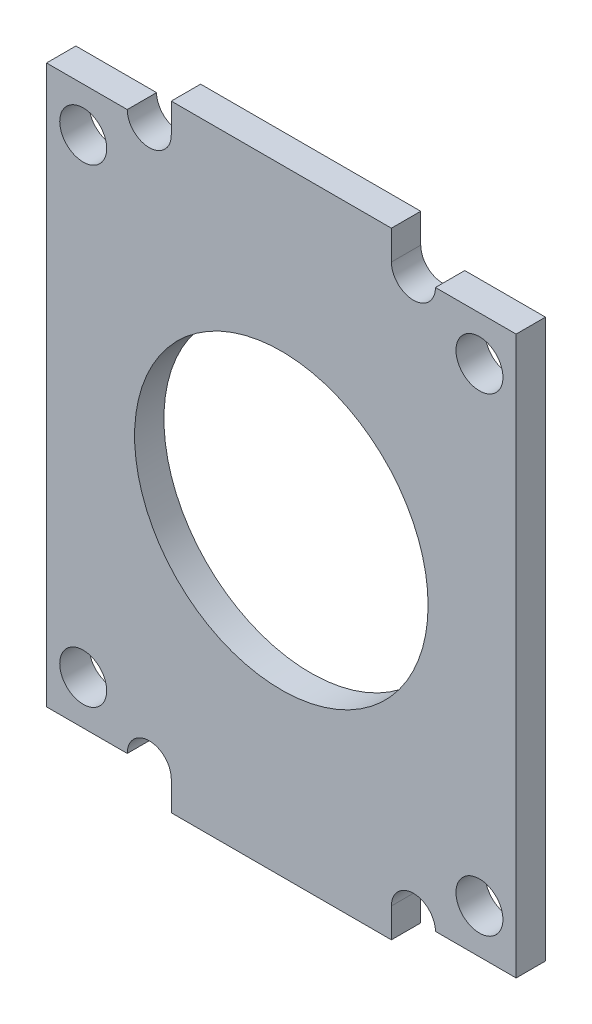
ISO-10303-21;
HEADER;
FILE_DESCRIPTION(('STEP AP214'),'2;1');
FILE_NAME('part.step','',(''),(''),'','','');
FILE_SCHEMA(('AUTOMOTIVE_DESIGN { 1 0 10303 214 1 1 1 1 }'));
ENDSEC;
DATA;
#1=APPLICATION_CONTEXT('core data for automotive mechanical design processes');
#2=APPLICATION_PROTOCOL_DEFINITION('international standard','automotive_design',2000,#1);
#3=PRODUCT_CONTEXT('',#1,'mechanical');
#4=PRODUCT('Part','Part','',(#3));
#5=PRODUCT_RELATED_PRODUCT_CATEGORY('part','',(#4));
#6=PRODUCT_DEFINITION_FORMATION('','',#4);
#7=PRODUCT_DEFINITION_CONTEXT('part definition',#1,'design');
#8=PRODUCT_DEFINITION('design','',#6,#7);
#9=PRODUCT_DEFINITION_SHAPE('','',#8);
#10=(LENGTH_UNIT() NAMED_UNIT(*) SI_UNIT(.MILLI.,.METRE.));
#11=(NAMED_UNIT(*) PLANE_ANGLE_UNIT() SI_UNIT($,.RADIAN.));
#12=(NAMED_UNIT(*) SI_UNIT($,.STERADIAN.) SOLID_ANGLE_UNIT());
#13=UNCERTAINTY_MEASURE_WITH_UNIT(LENGTH_MEASURE(1.E-05),#10,'distance_accuracy_value','');
#14=(GEOMETRIC_REPRESENTATION_CONTEXT(3) GLOBAL_UNCERTAINTY_ASSIGNED_CONTEXT((#13)) GLOBAL_UNIT_ASSIGNED_CONTEXT((#10,
#11,#12)) REPRESENTATION_CONTEXT('',''));
#15=CARTESIAN_POINT('',(0.,0.,0.));
#16=DIRECTION('',(0.,0.,1.));
#17=DIRECTION('',(1.,0.,0.));
#18=AXIS2_PLACEMENT_3D('',#15,#16,#17);
#19=CARTESIAN_POINT('',(-16.,-19.,2.));
#20=DIRECTION('',(0.,1.,0.));
#21=DIRECTION('',(0.,0.,1.));
#22=AXIS2_PLACEMENT_3D('',#19,#20,#21);
#23=PLANE('',#22);
#24=DIRECTION('',(1.,0.,0.));
#25=VECTOR('',#24,1.);
#26=CARTESIAN_POINT('',(-16.,-19.,2.));
#27=LINE('',#26,#25);
#28=CARTESIAN_POINT('',(10.5,-19.,2.));
#29=VERTEX_POINT('',#28);
#30=CARTESIAN_POINT('',(16.,-19.,2.));
#31=VERTEX_POINT('',#30);
#32=EDGE_CURVE('E52',#29,#31,#27,.T.);
#33=ORIENTED_EDGE('',*,*,#32,.F.);
#34=DIRECTION('',(0.,0.,1.));
#35=VECTOR('',#34,1.);
#36=CARTESIAN_POINT('',(10.5,-19.,-1.));
#37=LINE('',#36,#35);
#38=CARTESIAN_POINT('',(10.5,-19.,0.));
#39=VERTEX_POINT('',#38);
#40=EDGE_CURVE('E159',#29,#39,#37,.F.);
#41=ORIENTED_EDGE('',*,*,#40,.T.);
#42=DIRECTION('',(1.,0.,0.));
#43=VECTOR('',#42,1.);
#44=CARTESIAN_POINT('',(-16.,-19.,0.));
#45=LINE('',#44,#43);
#46=CARTESIAN_POINT('',(16.,-19.,0.));
#47=VERTEX_POINT('',#46);
#48=EDGE_CURVE('E78',#39,#47,#45,.T.);
#49=ORIENTED_EDGE('',*,*,#48,.T.);
#50=DIRECTION('',(0.,0.,-1.));
#51=VECTOR('',#50,1.);
#52=CARTESIAN_POINT('',(16.,-19.,2.));
#53=LINE('',#52,#51);
#54=EDGE_CURVE('E177',#31,#47,#53,.T.);
#55=ORIENTED_EDGE('',*,*,#54,.F.);
#56=EDGE_LOOP('',(#33,#41,#49,#55));
#57=FACE_BOUND('',#56,.T.);
#58=ADVANCED_FACE('F34',(#57),#23,.F.);
#59=CARTESIAN_POINT('',(-16.,19.,2.));
#60=DIRECTION('',(0.,-1.,0.));
#61=DIRECTION('',(0.,0.,-1.));
#62=AXIS2_PLACEMENT_3D('',#59,#60,#61);
#63=PLANE('',#62);
#64=DIRECTION('',(-1.,0.,0.));
#65=VECTOR('',#64,1.);
#66=CARTESIAN_POINT('',(-16.,19.,2.));
#67=LINE('',#66,#65);
#68=CARTESIAN_POINT('',(-10.5,19.,2.));
#69=VERTEX_POINT('',#68);
#70=CARTESIAN_POINT('',(-16.,19.,2.));
#71=VERTEX_POINT('',#70);
#72=EDGE_CURVE('E222',#69,#71,#67,.T.);
#73=ORIENTED_EDGE('',*,*,#72,.F.);
#74=DIRECTION('',(0.,0.,1.));
#75=VECTOR('',#74,1.);
#76=CARTESIAN_POINT('',(-10.5,19.,-1.));
#77=LINE('',#76,#75);
#78=CARTESIAN_POINT('',(-10.5,19.,0.));
#79=VERTEX_POINT('',#78);
#80=EDGE_CURVE('E272',#69,#79,#77,.F.);
#81=ORIENTED_EDGE('',*,*,#80,.T.);
#82=DIRECTION('',(-1.,0.,0.));
#83=VECTOR('',#82,1.);
#84=CARTESIAN_POINT('',(-16.,19.,0.));
#85=LINE('',#84,#83);
#86=CARTESIAN_POINT('',(-16.,19.,0.));
#87=VERTEX_POINT('',#86);
#88=EDGE_CURVE('E189',#79,#87,#85,.T.);
#89=ORIENTED_EDGE('',*,*,#88,.T.);
#90=DIRECTION('',(0.,0.,-1.));
#91=VECTOR('',#90,1.);
#92=CARTESIAN_POINT('',(-16.,19.,2.));
#93=LINE('',#92,#91);
#94=EDGE_CURVE('E44',#71,#87,#93,.T.);
#95=ORIENTED_EDGE('',*,*,#94,.F.);
#96=EDGE_LOOP('',(#73,#81,#89,#95));
#97=FACE_BOUND('',#96,.T.);
#98=ADVANCED_FACE('F354',(#97),#63,.F.);
#99=CARTESIAN_POINT('',(16.,19.,2.));
#100=DIRECTION('',(-1.,0.,0.));
#101=DIRECTION('',(0.,0.,1.));
#102=AXIS2_PLACEMENT_3D('',#99,#100,#101);
#103=PLANE('',#102);
#104=DIRECTION('',(0.,1.,0.));
#105=VECTOR('',#104,1.);
#106=CARTESIAN_POINT('',(16.,19.,0.));
#107=LINE('',#106,#105);
#108=CARTESIAN_POINT('',(16.,19.,0.));
#109=VERTEX_POINT('',#108);
#110=EDGE_CURVE('E186',#47,#109,#107,.T.);
#111=ORIENTED_EDGE('',*,*,#110,.T.);
#112=DIRECTION('',(0.,0.,-1.));
#113=VECTOR('',#112,1.);
#114=CARTESIAN_POINT('',(16.,19.,2.));
#115=LINE('',#114,#113);
#116=CARTESIAN_POINT('',(16.,19.,2.));
#117=VERTEX_POINT('',#116);
#118=EDGE_CURVE('E11',#117,#109,#115,.T.);
#119=ORIENTED_EDGE('',*,*,#118,.F.);
#120=DIRECTION('',(0.,1.,0.));
#121=VECTOR('',#120,1.);
#122=CARTESIAN_POINT('',(16.,19.,2.));
#123=LINE('',#122,#121);
#124=EDGE_CURVE('E197',#31,#117,#123,.T.);
#125=ORIENTED_EDGE('',*,*,#124,.F.);
#126=ORIENTED_EDGE('',*,*,#54,.T.);
#127=EDGE_LOOP('',(#111,#119,#125,#126));
#128=FACE_BOUND('',#127,.T.);
#129=ADVANCED_FACE('F36',(#128),#103,.F.);
#130=CARTESIAN_POINT('',(10.5,19.,0.));
#131=VERTEX_POINT('',#130);
#132=EDGE_CURVE('E190',#109,#131,#85,.T.);
#133=ORIENTED_EDGE('',*,*,#132,.T.);
#134=DIRECTION('',(0.,0.,1.));
#135=VECTOR('',#134,1.);
#136=CARTESIAN_POINT('',(10.5,19.,-1.));
#137=LINE('',#136,#135);
#138=CARTESIAN_POINT('',(10.5,19.,2.));
#139=VERTEX_POINT('',#138);
#140=EDGE_CURVE('E284',#131,#139,#137,.T.);
#141=ORIENTED_EDGE('',*,*,#140,.T.);
#142=EDGE_CURVE('E85',#117,#139,#67,.T.);
#143=ORIENTED_EDGE('',*,*,#142,.F.);
#144=ORIENTED_EDGE('',*,*,#118,.T.);
#145=EDGE_LOOP('',(#133,#141,#143,#144));
#146=FACE_BOUND('',#145,.T.);
#147=ADVANCED_FACE('F359',(#146),#63,.F.);
#148=CARTESIAN_POINT('',(-16.,19.,2.));
#149=DIRECTION('',(1.,0.,0.));
#150=DIRECTION('',(0.,0.,-1.));
#151=AXIS2_PLACEMENT_3D('',#148,#149,#150);
#152=PLANE('',#151);
#153=DIRECTION('',(0.,-1.,0.));
#154=VECTOR('',#153,1.);
#155=CARTESIAN_POINT('',(-16.,19.,0.));
#156=LINE('',#155,#154);
#157=CARTESIAN_POINT('',(-16.,-19.,0.));
#158=VERTEX_POINT('',#157);
#159=EDGE_CURVE('E71',#87,#158,#156,.T.);
#160=ORIENTED_EDGE('',*,*,#159,.T.);
#161=DIRECTION('',(0.,0.,-1.));
#162=VECTOR('',#161,1.);
#163=CARTESIAN_POINT('',(-16.,-19.,2.));
#164=LINE('',#163,#162);
#165=CARTESIAN_POINT('',(-16.,-19.,2.));
#166=VERTEX_POINT('',#165);
#167=EDGE_CURVE('E199',#166,#158,#164,.T.);
#168=ORIENTED_EDGE('',*,*,#167,.F.);
#169=DIRECTION('',(0.,-1.,0.));
#170=VECTOR('',#169,1.);
#171=CARTESIAN_POINT('',(-16.,19.,2.));
#172=LINE('',#171,#170);
#173=EDGE_CURVE('E180',#71,#166,#172,.T.);
#174=ORIENTED_EDGE('',*,*,#173,.F.);
#175=ORIENTED_EDGE('',*,*,#94,.T.);
#176=EDGE_LOOP('',(#160,#168,#174,#175));
#177=FACE_BOUND('',#176,.T.);
#178=ADVANCED_FACE('F203',(#177),#152,.F.);
#179=CARTESIAN_POINT('',(-10.5,-19.,0.));
#180=VERTEX_POINT('',#179);
#181=EDGE_CURVE('E194',#158,#180,#45,.T.);
#182=ORIENTED_EDGE('',*,*,#181,.T.);
#183=DIRECTION('',(0.,0.,1.));
#184=VECTOR('',#183,1.);
#185=CARTESIAN_POINT('',(-10.5,-19.,-1.));
#186=LINE('',#185,#184);
#187=CARTESIAN_POINT('',(-10.5,-19.,2.));
#188=VERTEX_POINT('',#187);
#189=EDGE_CURVE('E217',#180,#188,#186,.T.);
#190=ORIENTED_EDGE('',*,*,#189,.T.);
#191=EDGE_CURVE('E179',#166,#188,#27,.T.);
#192=ORIENTED_EDGE('',*,*,#191,.F.);
#193=ORIENTED_EDGE('',*,*,#167,.T.);
#194=EDGE_LOOP('',(#182,#190,#192,#193));
#195=FACE_BOUND('',#194,.T.);
#196=ADVANCED_FACE('F215',(#195),#23,.F.);
#197=CARTESIAN_POINT('',(0.,0.,2.));
#198=DIRECTION('',(0.,0.,1.));
#199=DIRECTION('',(1.,0.,0.));
#200=AXIS2_PLACEMENT_3D('',#197,#198,#199);
#201=PLANE('',#200);
#202=CARTESIAN_POINT('',(13.5,-16.,2.));
#203=DIRECTION('',(0.,0.,1.));
#204=DIRECTION('',(1.,0.,0.));
#205=AXIS2_PLACEMENT_3D('',#202,#203,#204);
#206=CIRCLE('',#205,1.6);
#207=CARTESIAN_POINT('',(15.1,-16.,2.));
#208=VERTEX_POINT('',#207);
#209=EDGE_CURVE('E312',#208,#208,#206,.T.);
#210=ORIENTED_EDGE('',*,*,#209,.F.);
#211=EDGE_LOOP('',(#210));
#212=FACE_BOUND('',#211,.T.);
#213=CARTESIAN_POINT('',(-13.5,-16.,2.));
#214=DIRECTION('',(0.,0.,1.));
#215=DIRECTION('',(-1.,0.,0.));
#216=AXIS2_PLACEMENT_3D('',#213,#214,#215);
#217=CIRCLE('',#216,1.6);
#218=CARTESIAN_POINT('',(-15.1,-16.,2.));
#219=VERTEX_POINT('',#218);
#220=EDGE_CURVE('E306',#219,#219,#217,.T.);
#221=ORIENTED_EDGE('',*,*,#220,.F.);
#222=EDGE_LOOP('',(#221));
#223=FACE_BOUND('',#222,.T.);
#224=CARTESIAN_POINT('',(-13.5,16.,2.));
#225=DIRECTION('',(0.,0.,1.));
#226=DIRECTION('',(-1.,0.,0.));
#227=AXIS2_PLACEMENT_3D('',#224,#225,#226);
#228=CIRCLE('',#227,1.6);
#229=CARTESIAN_POINT('',(-15.1,16.,2.));
#230=VERTEX_POINT('',#229);
#231=EDGE_CURVE('E300',#230,#230,#228,.T.);
#232=ORIENTED_EDGE('',*,*,#231,.F.);
#233=EDGE_LOOP('',(#232));
#234=FACE_BOUND('',#233,.T.);
#235=CARTESIAN_POINT('',(13.5,16.,2.));
#236=DIRECTION('',(0.,0.,1.));
#237=DIRECTION('',(1.,0.,0.));
#238=AXIS2_PLACEMENT_3D('',#235,#236,#237);
#239=CIRCLE('',#238,1.6);
#240=CARTESIAN_POINT('',(15.1,16.,2.));
#241=VERTEX_POINT('',#240);
#242=EDGE_CURVE('E294',#241,#241,#239,.T.);
#243=ORIENTED_EDGE('',*,*,#242,.F.);
#244=EDGE_LOOP('',(#243));
#245=FACE_BOUND('',#244,.T.);
#246=CARTESIAN_POINT('',(-9.,-19.,2.));
#247=DIRECTION('',(0.,0.,1.));
#248=DIRECTION('',(1.,0.,0.));
#249=AXIS2_PLACEMENT_3D('',#246,#247,#248);
#250=CIRCLE('',#249,1.5);
#251=CARTESIAN_POINT('',(-7.5,-19.,2.));
#252=VERTEX_POINT('',#251);
#253=EDGE_CURVE('E219',#252,#188,#250,.T.);
#254=ORIENTED_EDGE('',*,*,#253,.F.);
#255=DIRECTION('',(0.,-1.,0.));
#256=VECTOR('',#255,1.);
#257=CARTESIAN_POINT('',(-7.5,-19.,2.));
#258=LINE('',#257,#256);
#259=CARTESIAN_POINT('',(-7.5,-21.,2.));
#260=VERTEX_POINT('',#259);
#261=EDGE_CURVE('E270',#252,#260,#258,.T.);
#262=ORIENTED_EDGE('',*,*,#261,.T.);
#263=DIRECTION('',(1.,0.,0.));
#264=VECTOR('',#263,1.);
#265=CARTESIAN_POINT('',(-7.5,-21.,2.));
#266=LINE('',#265,#264);
#267=CARTESIAN_POINT('',(7.5,-21.,2.));
#268=VERTEX_POINT('',#267);
#269=EDGE_CURVE('E268',#260,#268,#266,.T.);
#270=ORIENTED_EDGE('',*,*,#269,.T.);
#271=DIRECTION('',(0.,1.,0.));
#272=VECTOR('',#271,1.);
#273=CARTESIAN_POINT('',(7.5,-19.,2.));
#274=LINE('',#273,#272);
#275=CARTESIAN_POINT('',(7.5,-19.,2.));
#276=VERTEX_POINT('',#275);
#277=EDGE_CURVE('E173',#268,#276,#274,.T.);
#278=ORIENTED_EDGE('',*,*,#277,.T.);
#279=CARTESIAN_POINT('',(9.,-19.,2.));
#280=DIRECTION('',(0.,0.,1.));
#281=DIRECTION('',(1.,0.,0.));
#282=AXIS2_PLACEMENT_3D('',#279,#280,#281);
#283=CIRCLE('',#282,1.5);
#284=EDGE_CURVE('E161',#29,#276,#283,.T.);
#285=ORIENTED_EDGE('',*,*,#284,.F.);
#286=ORIENTED_EDGE('',*,*,#32,.T.);
#287=ORIENTED_EDGE('',*,*,#124,.T.);
#288=ORIENTED_EDGE('',*,*,#142,.T.);
#289=CARTESIAN_POINT('',(9.,19.,2.));
#290=DIRECTION('',(0.,0.,1.));
#291=DIRECTION('',(1.,0.,0.));
#292=AXIS2_PLACEMENT_3D('',#289,#290,#291);
#293=CIRCLE('',#292,1.5);
#294=CARTESIAN_POINT('',(7.49999999999999,19.,2.));
#295=VERTEX_POINT('',#294);
#296=EDGE_CURVE('E174',#295,#139,#293,.T.);
#297=ORIENTED_EDGE('',*,*,#296,.F.);
#298=DIRECTION('',(0.,1.,0.));
#299=VECTOR('',#298,1.);
#300=CARTESIAN_POINT('',(7.49999999999999,19.,2.));
#301=LINE('',#300,#299);
#302=CARTESIAN_POINT('',(7.49999999999999,21.,2.));
#303=VERTEX_POINT('',#302);
#304=EDGE_CURVE('E245',#295,#303,#301,.T.);
#305=ORIENTED_EDGE('',*,*,#304,.T.);
#306=DIRECTION('',(-1.,0.,0.));
#307=VECTOR('',#306,1.);
#308=CARTESIAN_POINT('',(-7.5,21.,2.));
#309=LINE('',#308,#307);
#310=CARTESIAN_POINT('',(-7.5,21.,2.));
#311=VERTEX_POINT('',#310);
#312=EDGE_CURVE('E241',#303,#311,#309,.T.);
#313=ORIENTED_EDGE('',*,*,#312,.T.);
#314=DIRECTION('',(0.,-1.,0.));
#315=VECTOR('',#314,1.);
#316=CARTESIAN_POINT('',(-7.5,19.,2.));
#317=LINE('',#316,#315);
#318=CARTESIAN_POINT('',(-7.5,19.,2.));
#319=VERTEX_POINT('',#318);
#320=EDGE_CURVE('E248',#311,#319,#317,.T.);
#321=ORIENTED_EDGE('',*,*,#320,.T.);
#322=CARTESIAN_POINT('',(-9.,19.,2.));
#323=DIRECTION('',(0.,0.,1.));
#324=DIRECTION('',(1.,0.,0.));
#325=AXIS2_PLACEMENT_3D('',#322,#323,#324);
#326=CIRCLE('',#325,1.5);
#327=EDGE_CURVE('E224',#69,#319,#326,.T.);
#328=ORIENTED_EDGE('',*,*,#327,.F.);
#329=ORIENTED_EDGE('',*,*,#72,.T.);
#330=ORIENTED_EDGE('',*,*,#173,.T.);
#331=ORIENTED_EDGE('',*,*,#191,.T.);
#332=EDGE_LOOP('',(#254,#262,#270,#278,#285,#286,#287,#288,#297,#305,#313,#321,#328,#329,#330,#331));
#333=FACE_BOUND('',#332,.T.);
#334=CARTESIAN_POINT('',(0.,0.,2.));
#335=DIRECTION('',(0.,0.,1.));
#336=DIRECTION('',(1.,0.,0.));
#337=AXIS2_PLACEMENT_3D('',#334,#335,#336);
#338=CIRCLE('',#337,10.);
#339=CARTESIAN_POINT('',(10.,0.,2.));
#340=VERTEX_POINT('',#339);
#341=EDGE_CURVE('E228',#340,#340,#338,.T.);
#342=ORIENTED_EDGE('',*,*,#341,.F.);
#343=EDGE_LOOP('',(#342));
#344=FACE_BOUND('',#343,.T.);
#345=ADVANCED_FACE('F169',(#212,#223,#234,#245,#333,#344),#201,.T.);
#346=CARTESIAN_POINT('',(0.,0.,0.));
#347=DIRECTION('',(0.,0.,1.));
#348=DIRECTION('',(1.,0.,0.));
#349=AXIS2_PLACEMENT_3D('',#346,#347,#348);
#350=PLANE('',#349);
#351=CARTESIAN_POINT('',(13.5,-16.,0.));
#352=DIRECTION('',(0.,0.,1.));
#353=DIRECTION('',(1.,0.,0.));
#354=AXIS2_PLACEMENT_3D('',#351,#352,#353);
#355=CIRCLE('',#354,1.6);
#356=CARTESIAN_POINT('',(15.1,-16.,0.));
#357=VERTEX_POINT('',#356);
#358=EDGE_CURVE('E297',#357,#357,#355,.T.);
#359=ORIENTED_EDGE('',*,*,#358,.T.);
#360=EDGE_LOOP('',(#359));
#361=FACE_BOUND('',#360,.T.);
#362=CARTESIAN_POINT('',(-13.5,-16.,0.));
#363=DIRECTION('',(0.,0.,1.));
#364=DIRECTION('',(-1.,0.,0.));
#365=AXIS2_PLACEMENT_3D('',#362,#363,#364);
#366=CIRCLE('',#365,1.6);
#367=CARTESIAN_POINT('',(-15.1,-16.,0.));
#368=VERTEX_POINT('',#367);
#369=EDGE_CURVE('E309',#368,#368,#366,.T.);
#370=ORIENTED_EDGE('',*,*,#369,.T.);
#371=EDGE_LOOP('',(#370));
#372=FACE_BOUND('',#371,.T.);
#373=CARTESIAN_POINT('',(-13.5,16.,0.));
#374=DIRECTION('',(0.,0.,1.));
#375=DIRECTION('',(-1.,0.,0.));
#376=AXIS2_PLACEMENT_3D('',#373,#374,#375);
#377=CIRCLE('',#376,1.6);
#378=CARTESIAN_POINT('',(-15.1,16.,0.));
#379=VERTEX_POINT('',#378);
#380=EDGE_CURVE('E303',#379,#379,#377,.T.);
#381=ORIENTED_EDGE('',*,*,#380,.T.);
#382=EDGE_LOOP('',(#381));
#383=FACE_BOUND('',#382,.T.);
#384=CARTESIAN_POINT('',(13.5,16.,0.));
#385=DIRECTION('',(0.,0.,1.));
#386=DIRECTION('',(1.,0.,0.));
#387=AXIS2_PLACEMENT_3D('',#384,#385,#386);
#388=CIRCLE('',#387,1.6);
#389=CARTESIAN_POINT('',(15.1,16.,0.));
#390=VERTEX_POINT('',#389);
#391=EDGE_CURVE('E175',#390,#390,#388,.T.);
#392=ORIENTED_EDGE('',*,*,#391,.T.);
#393=EDGE_LOOP('',(#392));
#394=FACE_BOUND('',#393,.T.);
#395=CARTESIAN_POINT('',(0.,0.,0.));
#396=DIRECTION('',(0.,0.,1.));
#397=DIRECTION('',(1.,0.,0.));
#398=AXIS2_PLACEMENT_3D('',#395,#396,#397);
#399=CIRCLE('',#398,10.);
#400=CARTESIAN_POINT('',(10.,0.,0.));
#401=VERTEX_POINT('',#400);
#402=EDGE_CURVE('E38',#401,#401,#399,.T.);
#403=ORIENTED_EDGE('',*,*,#402,.T.);
#404=EDGE_LOOP('',(#403));
#405=FACE_BOUND('',#404,.T.);
#406=DIRECTION('',(0.,-1.,0.));
#407=VECTOR('',#406,1.);
#408=CARTESIAN_POINT('',(-7.5,-19.,0.));
#409=LINE('',#408,#407);
#410=CARTESIAN_POINT('',(-7.5,-19.,0.));
#411=VERTEX_POINT('',#410);
#412=CARTESIAN_POINT('',(-7.5,-21.,0.));
#413=VERTEX_POINT('',#412);
#414=EDGE_CURVE('E267',#411,#413,#409,.T.);
#415=ORIENTED_EDGE('',*,*,#414,.F.);
#416=CARTESIAN_POINT('',(-9.,-19.,0.));
#417=DIRECTION('',(0.,0.,1.));
#418=DIRECTION('',(1.,0.,0.));
#419=AXIS2_PLACEMENT_3D('',#416,#417,#418);
#420=CIRCLE('',#419,1.5);
#421=EDGE_CURVE('E165',#411,#180,#420,.T.);
#422=ORIENTED_EDGE('',*,*,#421,.T.);
#423=ORIENTED_EDGE('',*,*,#181,.F.);
#424=ORIENTED_EDGE('',*,*,#159,.F.);
#425=ORIENTED_EDGE('',*,*,#88,.F.);
#426=CARTESIAN_POINT('',(-9.,19.,0.));
#427=DIRECTION('',(0.,0.,1.));
#428=DIRECTION('',(1.,0.,0.));
#429=AXIS2_PLACEMENT_3D('',#426,#427,#428);
#430=CIRCLE('',#429,1.5);
#431=CARTESIAN_POINT('',(-7.5,19.,0.));
#432=VERTEX_POINT('',#431);
#433=EDGE_CURVE('E281',#79,#432,#430,.T.);
#434=ORIENTED_EDGE('',*,*,#433,.T.);
#435=DIRECTION('',(0.,-1.,0.));
#436=VECTOR('',#435,1.);
#437=CARTESIAN_POINT('',(-7.5,19.,0.));
#438=LINE('',#437,#436);
#439=CARTESIAN_POINT('',(-7.5,21.,0.));
#440=VERTEX_POINT('',#439);
#441=EDGE_CURVE('E244',#440,#432,#438,.T.);
#442=ORIENTED_EDGE('',*,*,#441,.F.);
#443=DIRECTION('',(-1.,0.,0.));
#444=VECTOR('',#443,1.);
#445=CARTESIAN_POINT('',(-7.5,21.,0.));
#446=LINE('',#445,#444);
#447=CARTESIAN_POINT('',(7.49999999999999,21.,0.));
#448=VERTEX_POINT('',#447);
#449=EDGE_CURVE('E236',#448,#440,#446,.T.);
#450=ORIENTED_EDGE('',*,*,#449,.F.);
#451=DIRECTION('',(0.,1.,0.));
#452=VECTOR('',#451,1.);
#453=CARTESIAN_POINT('',(7.49999999999999,19.,0.));
#454=LINE('',#453,#452);
#455=CARTESIAN_POINT('',(7.49999999999999,19.,0.));
#456=VERTEX_POINT('',#455);
#457=EDGE_CURVE('E253',#456,#448,#454,.T.);
#458=ORIENTED_EDGE('',*,*,#457,.F.);
#459=CARTESIAN_POINT('',(9.,19.,0.));
#460=DIRECTION('',(0.,0.,1.));
#461=DIRECTION('',(1.,0.,0.));
#462=AXIS2_PLACEMENT_3D('',#459,#460,#461);
#463=CIRCLE('',#462,1.5);
#464=EDGE_CURVE('E286',#456,#131,#463,.T.);
#465=ORIENTED_EDGE('',*,*,#464,.T.);
#466=ORIENTED_EDGE('',*,*,#132,.F.);
#467=ORIENTED_EDGE('',*,*,#110,.F.);
#468=ORIENTED_EDGE('',*,*,#48,.F.);
#469=CARTESIAN_POINT('',(9.,-19.,0.));
#470=DIRECTION('',(0.,0.,1.));
#471=DIRECTION('',(1.,0.,0.));
#472=AXIS2_PLACEMENT_3D('',#469,#470,#471);
#473=CIRCLE('',#472,1.5);
#474=CARTESIAN_POINT('',(7.5,-19.,0.));
#475=VERTEX_POINT('',#474);
#476=EDGE_CURVE('E164',#39,#475,#473,.T.);
#477=ORIENTED_EDGE('',*,*,#476,.T.);
#478=DIRECTION('',(0.,1.,0.));
#479=VECTOR('',#478,1.);
#480=CARTESIAN_POINT('',(7.5,-19.,0.));
#481=LINE('',#480,#479);
#482=CARTESIAN_POINT('',(7.5,-21.,0.));
#483=VERTEX_POINT('',#482);
#484=EDGE_CURVE('E261',#483,#475,#481,.T.);
#485=ORIENTED_EDGE('',*,*,#484,.F.);
#486=DIRECTION('',(1.,0.,0.));
#487=VECTOR('',#486,1.);
#488=CARTESIAN_POINT('',(-7.5,-21.,0.));
#489=LINE('',#488,#487);
#490=EDGE_CURVE('E275',#413,#483,#489,.T.);
#491=ORIENTED_EDGE('',*,*,#490,.F.);
#492=EDGE_LOOP('',(#415,#422,#423,#424,#425,#434,#442,#450,#458,#465,#466,#467,#468,#477,#485,#491));
#493=FACE_BOUND('',#492,.T.);
#494=ADVANCED_FACE('F210',(#361,#372,#383,#394,#405,#493),#350,.F.);
#495=CARTESIAN_POINT('',(0.,0.,-1.));
#496=DIRECTION('',(0.,0.,1.));
#497=DIRECTION('',(1.,0.,0.));
#498=AXIS2_PLACEMENT_3D('',#495,#496,#497);
#499=CYLINDRICAL_SURFACE('',#498,10.);
#500=ORIENTED_EDGE('',*,*,#341,.T.);
#501=EDGE_LOOP('',(#500));
#502=FACE_BOUND('',#501,.T.);
#503=ORIENTED_EDGE('',*,*,#402,.F.);
#504=EDGE_LOOP('',(#503));
#505=FACE_BOUND('',#504,.T.);
#506=ADVANCED_FACE('F416',(#502,#505),#499,.F.);
#507=CARTESIAN_POINT('',(-7.5,19.,0.));
#508=DIRECTION('',(-1.,0.,0.));
#509=DIRECTION('',(0.,0.,1.));
#510=AXIS2_PLACEMENT_3D('',#507,#508,#509);
#511=PLANE('',#510);
#512=ORIENTED_EDGE('',*,*,#320,.F.);
#513=DIRECTION('',(0.,0.,1.));
#514=VECTOR('',#513,1.);
#515=CARTESIAN_POINT('',(-7.5,21.,0.));
#516=LINE('',#515,#514);
#517=EDGE_CURVE('E231',#440,#311,#516,.T.);
#518=ORIENTED_EDGE('',*,*,#517,.F.);
#519=ORIENTED_EDGE('',*,*,#441,.T.);
#520=DIRECTION('',(0.,0.,1.));
#521=VECTOR('',#520,1.);
#522=CARTESIAN_POINT('',(-7.5,19.,0.));
#523=LINE('',#522,#521);
#524=EDGE_CURVE('E232',#432,#319,#523,.T.);
#525=ORIENTED_EDGE('',*,*,#524,.T.);
#526=EDGE_LOOP('',(#512,#518,#519,#525));
#527=FACE_BOUND('',#526,.T.);
#528=ADVANCED_FACE('F388',(#527),#511,.T.);
#529=CARTESIAN_POINT('',(-7.5,21.,0.));
#530=DIRECTION('',(0.,1.,0.));
#531=DIRECTION('',(0.,0.,1.));
#532=AXIS2_PLACEMENT_3D('',#529,#530,#531);
#533=PLANE('',#532);
#534=ORIENTED_EDGE('',*,*,#312,.F.);
#535=DIRECTION('',(0.,0.,1.));
#536=VECTOR('',#535,1.);
#537=CARTESIAN_POINT('',(7.49999999999999,21.,0.));
#538=LINE('',#537,#536);
#539=EDGE_CURVE('E238',#448,#303,#538,.T.);
#540=ORIENTED_EDGE('',*,*,#539,.F.);
#541=ORIENTED_EDGE('',*,*,#449,.T.);
#542=ORIENTED_EDGE('',*,*,#517,.T.);
#543=EDGE_LOOP('',(#534,#540,#541,#542));
#544=FACE_BOUND('',#543,.T.);
#545=ADVANCED_FACE('F384',(#544),#533,.T.);
#546=CARTESIAN_POINT('',(7.49999999999999,19.,0.));
#547=DIRECTION('',(1.,0.,0.));
#548=DIRECTION('',(0.,0.,-1.));
#549=AXIS2_PLACEMENT_3D('',#546,#547,#548);
#550=PLANE('',#549);
#551=ORIENTED_EDGE('',*,*,#304,.F.);
#552=DIRECTION('',(0.,0.,1.));
#553=VECTOR('',#552,1.);
#554=CARTESIAN_POINT('',(7.49999999999999,19.,0.));
#555=LINE('',#554,#553);
#556=EDGE_CURVE('E235',#456,#295,#555,.T.);
#557=ORIENTED_EDGE('',*,*,#556,.F.);
#558=ORIENTED_EDGE('',*,*,#457,.T.);
#559=ORIENTED_EDGE('',*,*,#539,.T.);
#560=EDGE_LOOP('',(#551,#557,#558,#559));
#561=FACE_BOUND('',#560,.T.);
#562=ADVANCED_FACE('F381',(#561),#550,.T.);
#563=CARTESIAN_POINT('',(-7.5,-19.,0.));
#564=DIRECTION('',(-1.,0.,0.));
#565=DIRECTION('',(0.,0.,1.));
#566=AXIS2_PLACEMENT_3D('',#563,#564,#565);
#567=PLANE('',#566);
#568=ORIENTED_EDGE('',*,*,#261,.F.);
#569=DIRECTION('',(0.,0.,1.));
#570=VECTOR('',#569,1.);
#571=CARTESIAN_POINT('',(-7.5,-19.,0.));
#572=LINE('',#571,#570);
#573=EDGE_CURVE('E250',#411,#252,#572,.T.);
#574=ORIENTED_EDGE('',*,*,#573,.F.);
#575=ORIENTED_EDGE('',*,*,#414,.T.);
#576=DIRECTION('',(0.,0.,1.));
#577=VECTOR('',#576,1.);
#578=CARTESIAN_POINT('',(-7.5,-21.,0.));
#579=LINE('',#578,#577);
#580=EDGE_CURVE('E258',#413,#260,#579,.T.);
#581=ORIENTED_EDGE('',*,*,#580,.T.);
#582=EDGE_LOOP('',(#568,#574,#575,#581));
#583=FACE_BOUND('',#582,.T.);
#584=ADVANCED_FACE('F404',(#583),#567,.T.);
#585=CARTESIAN_POINT('',(7.5,-19.,0.));
#586=DIRECTION('',(1.,0.,0.));
#587=DIRECTION('',(0.,0.,-1.));
#588=AXIS2_PLACEMENT_3D('',#585,#586,#587);
#589=PLANE('',#588);
#590=ORIENTED_EDGE('',*,*,#277,.F.);
#591=DIRECTION('',(0.,0.,1.));
#592=VECTOR('',#591,1.);
#593=CARTESIAN_POINT('',(7.5,-21.,0.));
#594=LINE('',#593,#592);
#595=EDGE_CURVE('E260',#483,#268,#594,.T.);
#596=ORIENTED_EDGE('',*,*,#595,.F.);
#597=ORIENTED_EDGE('',*,*,#484,.T.);
#598=DIRECTION('',(0.,0.,1.));
#599=VECTOR('',#598,1.);
#600=CARTESIAN_POINT('',(7.5,-19.,0.));
#601=LINE('',#600,#599);
#602=EDGE_CURVE('E263',#475,#276,#601,.T.);
#603=ORIENTED_EDGE('',*,*,#602,.T.);
#604=EDGE_LOOP('',(#590,#596,#597,#603));
#605=FACE_BOUND('',#604,.T.);
#606=ADVANCED_FACE('F399',(#605),#589,.T.);
#607=CARTESIAN_POINT('',(-7.5,-21.,0.));
#608=DIRECTION('',(0.,-1.,0.));
#609=DIRECTION('',(0.,0.,-1.));
#610=AXIS2_PLACEMENT_3D('',#607,#608,#609);
#611=PLANE('',#610);
#612=ORIENTED_EDGE('',*,*,#269,.F.);
#613=ORIENTED_EDGE('',*,*,#580,.F.);
#614=ORIENTED_EDGE('',*,*,#490,.T.);
#615=ORIENTED_EDGE('',*,*,#595,.T.);
#616=EDGE_LOOP('',(#612,#613,#614,#615));
#617=FACE_BOUND('',#616,.T.);
#618=ADVANCED_FACE('F392',(#617),#611,.T.);
#619=CARTESIAN_POINT('',(-9.,19.,-1.));
#620=DIRECTION('',(0.,0.,1.));
#621=DIRECTION('',(1.,0.,0.));
#622=AXIS2_PLACEMENT_3D('',#619,#620,#621);
#623=CYLINDRICAL_SURFACE('',#622,1.5);
#624=ORIENTED_EDGE('',*,*,#327,.T.);
#625=ORIENTED_EDGE('',*,*,#524,.F.);
#626=ORIENTED_EDGE('',*,*,#433,.F.);
#627=ORIENTED_EDGE('',*,*,#80,.F.);
#628=EDGE_LOOP('',(#624,#625,#626,#627));
#629=FACE_BOUND('',#628,.T.);
#630=ADVANCED_FACE('F390',(#629),#623,.F.);
#631=CARTESIAN_POINT('',(9.,-19.,-1.));
#632=DIRECTION('',(0.,0.,1.));
#633=DIRECTION('',(1.,0.,0.));
#634=AXIS2_PLACEMENT_3D('',#631,#632,#633);
#635=CYLINDRICAL_SURFACE('',#634,1.5);
#636=ORIENTED_EDGE('',*,*,#284,.T.);
#637=ORIENTED_EDGE('',*,*,#602,.F.);
#638=ORIENTED_EDGE('',*,*,#476,.F.);
#639=ORIENTED_EDGE('',*,*,#40,.F.);
#640=EDGE_LOOP('',(#636,#637,#638,#639));
#641=FACE_BOUND('',#640,.T.);
#642=ADVANCED_FACE('F160',(#641),#635,.F.);
#643=CARTESIAN_POINT('',(-9.,-19.,-1.));
#644=DIRECTION('',(0.,0.,1.));
#645=DIRECTION('',(1.,0.,0.));
#646=AXIS2_PLACEMENT_3D('',#643,#644,#645);
#647=CYLINDRICAL_SURFACE('',#646,1.5);
#648=ORIENTED_EDGE('',*,*,#421,.F.);
#649=ORIENTED_EDGE('',*,*,#573,.T.);
#650=ORIENTED_EDGE('',*,*,#253,.T.);
#651=ORIENTED_EDGE('',*,*,#189,.F.);
#652=EDGE_LOOP('',(#648,#649,#650,#651));
#653=FACE_BOUND('',#652,.T.);
#654=ADVANCED_FACE('F348',(#653),#647,.F.);
#655=CARTESIAN_POINT('',(9.,19.,-1.));
#656=DIRECTION('',(0.,0.,1.));
#657=DIRECTION('',(1.,0.,0.));
#658=AXIS2_PLACEMENT_3D('',#655,#656,#657);
#659=CYLINDRICAL_SURFACE('',#658,1.5);
#660=ORIENTED_EDGE('',*,*,#464,.F.);
#661=ORIENTED_EDGE('',*,*,#556,.T.);
#662=ORIENTED_EDGE('',*,*,#296,.T.);
#663=ORIENTED_EDGE('',*,*,#140,.F.);
#664=EDGE_LOOP('',(#660,#661,#662,#663));
#665=FACE_BOUND('',#664,.T.);
#666=ADVANCED_FACE('F339',(#665),#659,.F.);
#667=CARTESIAN_POINT('',(13.5,16.,0.));
#668=DIRECTION('',(0.,0.,1.));
#669=DIRECTION('',(1.,0.,0.));
#670=AXIS2_PLACEMENT_3D('',#667,#668,#669);
#671=CYLINDRICAL_SURFACE('',#670,1.6);
#672=ORIENTED_EDGE('',*,*,#391,.F.);
#673=EDGE_LOOP('',(#672));
#674=FACE_BOUND('',#673,.T.);
#675=ORIENTED_EDGE('',*,*,#242,.T.);
#676=EDGE_LOOP('',(#675));
#677=FACE_BOUND('',#676,.T.);
#678=ADVANCED_FACE('F336',(#674,#677),#671,.F.);
#679=CARTESIAN_POINT('',(-13.5,16.,0.));
#680=DIRECTION('',(0.,0.,1.));
#681=DIRECTION('',(1.,0.,0.));
#682=AXIS2_PLACEMENT_3D('',#679,#680,#681);
#683=CYLINDRICAL_SURFACE('',#682,1.6);
#684=ORIENTED_EDGE('',*,*,#380,.F.);
#685=EDGE_LOOP('',(#684));
#686=FACE_BOUND('',#685,.T.);
#687=ORIENTED_EDGE('',*,*,#231,.T.);
#688=EDGE_LOOP('',(#687));
#689=FACE_BOUND('',#688,.T.);
#690=ADVANCED_FACE('F338',(#686,#689),#683,.F.);
#691=CARTESIAN_POINT('',(-13.5,-16.,0.));
#692=DIRECTION('',(0.,0.,1.));
#693=DIRECTION('',(1.,0.,0.));
#694=AXIS2_PLACEMENT_3D('',#691,#692,#693);
#695=CYLINDRICAL_SURFACE('',#694,1.6);
#696=ORIENTED_EDGE('',*,*,#369,.F.);
#697=EDGE_LOOP('',(#696));
#698=FACE_BOUND('',#697,.T.);
#699=ORIENTED_EDGE('',*,*,#220,.T.);
#700=EDGE_LOOP('',(#699));
#701=FACE_BOUND('',#700,.T.);
#702=ADVANCED_FACE('F323',(#698,#701),#695,.F.);
#703=CARTESIAN_POINT('',(13.5,-16.,0.));
#704=DIRECTION('',(0.,0.,1.));
#705=DIRECTION('',(1.,0.,0.));
#706=AXIS2_PLACEMENT_3D('',#703,#704,#705);
#707=CYLINDRICAL_SURFACE('',#706,1.6);
#708=ORIENTED_EDGE('',*,*,#358,.F.);
#709=EDGE_LOOP('',(#708));
#710=FACE_BOUND('',#709,.T.);
#711=ORIENTED_EDGE('',*,*,#209,.T.);
#712=EDGE_LOOP('',(#711));
#713=FACE_BOUND('',#712,.T.);
#714=ADVANCED_FACE('F320',(#710,#713),#707,.F.);
#715=CLOSED_SHELL('',(#58,#98,#129,#147,#178,#196,#345,#494,#506,#528,#545,#562,#584,#606,#618,
#630,#642,#654,#666,#678,#690,#702,#714));
#716=MANIFOLD_SOLID_BREP('B2',#715);
#717=ADVANCED_BREP_SHAPE_REPRESENTATION('',(#18,#716),#14);
#718=SHAPE_DEFINITION_REPRESENTATION(#9,#717);
ENDSEC;
END-ISO-10303-21;
